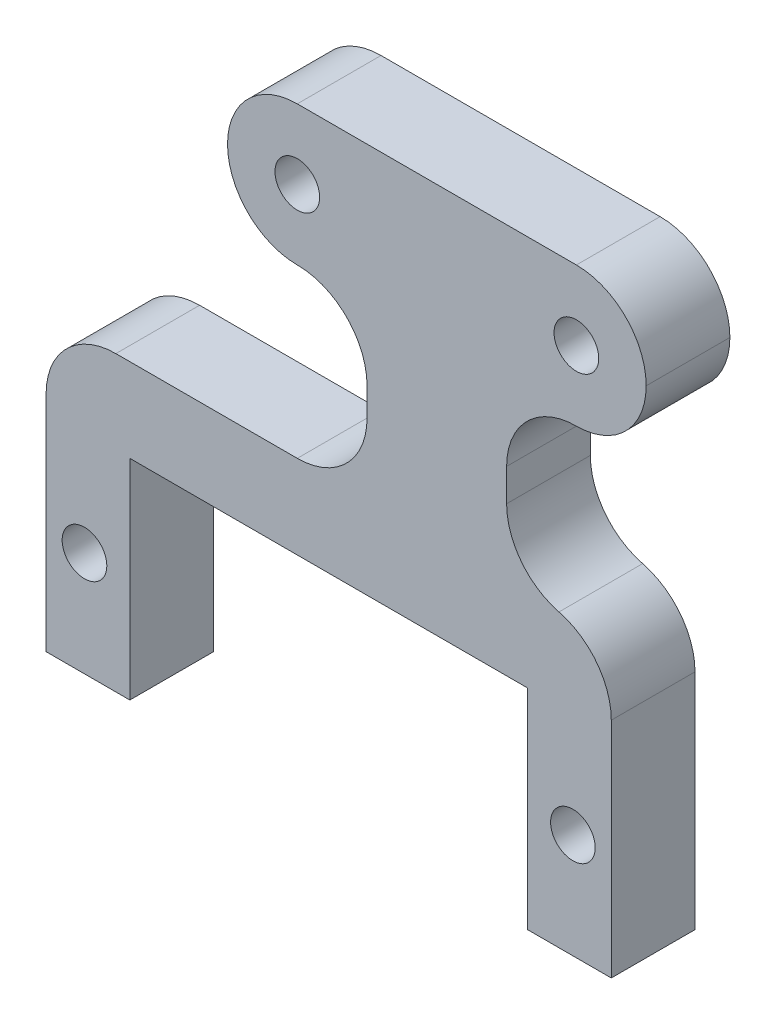
ISO-10303-21;
HEADER;
FILE_DESCRIPTION(('STEP AP214'),'2;1');
FILE_NAME('part.step','',(''),(''),'','','');
FILE_SCHEMA(('AUTOMOTIVE_DESIGN { 1 0 10303 214 1 1 1 1 }'));
ENDSEC;
DATA;
#1=APPLICATION_CONTEXT('core data for automotive mechanical design processes');
#2=APPLICATION_PROTOCOL_DEFINITION('international standard','automotive_design',2000,#1);
#3=PRODUCT_CONTEXT('',#1,'mechanical');
#4=PRODUCT('Part','Part','',(#3));
#5=PRODUCT_RELATED_PRODUCT_CATEGORY('part','',(#4));
#6=PRODUCT_DEFINITION_FORMATION('','',#4);
#7=PRODUCT_DEFINITION_CONTEXT('part definition',#1,'design');
#8=PRODUCT_DEFINITION('design','',#6,#7);
#9=PRODUCT_DEFINITION_SHAPE('','',#8);
#10=(LENGTH_UNIT() NAMED_UNIT(*) SI_UNIT(.MILLI.,.METRE.));
#11=(NAMED_UNIT(*) PLANE_ANGLE_UNIT() SI_UNIT($,.RADIAN.));
#12=(NAMED_UNIT(*) SI_UNIT($,.STERADIAN.) SOLID_ANGLE_UNIT());
#13=UNCERTAINTY_MEASURE_WITH_UNIT(LENGTH_MEASURE(1.E-05),#10,'distance_accuracy_value','');
#14=(GEOMETRIC_REPRESENTATION_CONTEXT(3) GLOBAL_UNCERTAINTY_ASSIGNED_CONTEXT((#13)) GLOBAL_UNIT_ASSIGNED_CONTEXT((#10,
#11,#12)) REPRESENTATION_CONTEXT('',''));
#15=CARTESIAN_POINT('',(0.,0.,0.));
#16=DIRECTION('',(0.,0.,1.));
#17=DIRECTION('',(1.,0.,0.));
#18=AXIS2_PLACEMENT_3D('',#15,#16,#17);
#19=CARTESIAN_POINT('',(-20.25,-15.,6.));
#20=DIRECTION('',(0.,1.,0.));
#21=DIRECTION('',(0.,0.,1.));
#22=AXIS2_PLACEMENT_3D('',#19,#20,#21);
#23=PLANE('',#22);
#24=DIRECTION('',(1.,0.,0.));
#25=VECTOR('',#24,1.);
#26=CARTESIAN_POINT('',(-20.25,-15.,0.));
#27=LINE('',#26,#25);
#28=CARTESIAN_POINT('',(-20.25,-15.,0.));
#29=VERTEX_POINT('',#28);
#30=CARTESIAN_POINT('',(-14.25,-15.,0.));
#31=VERTEX_POINT('',#30);
#32=EDGE_CURVE('E211',#29,#31,#27,.T.);
#33=ORIENTED_EDGE('',*,*,#32,.T.);
#34=DIRECTION('',(0.,0.,-1.));
#35=VECTOR('',#34,1.);
#36=CARTESIAN_POINT('',(-14.25,-15.,6.));
#37=LINE('',#36,#35);
#38=CARTESIAN_POINT('',(-14.25,-15.,6.));
#39=VERTEX_POINT('',#38);
#40=EDGE_CURVE('E192',#39,#31,#37,.T.);
#41=ORIENTED_EDGE('',*,*,#40,.F.);
#42=DIRECTION('',(1.,0.,0.));
#43=VECTOR('',#42,1.);
#44=CARTESIAN_POINT('',(-20.25,-15.,6.));
#45=LINE('',#44,#43);
#46=CARTESIAN_POINT('',(-20.25,-15.,6.));
#47=VERTEX_POINT('',#46);
#48=EDGE_CURVE('E178',#47,#39,#45,.T.);
#49=ORIENTED_EDGE('',*,*,#48,.F.);
#50=DIRECTION('',(0.,0.,-1.));
#51=VECTOR('',#50,1.);
#52=CARTESIAN_POINT('',(-20.25,-15.,6.));
#53=LINE('',#52,#51);
#54=EDGE_CURVE('E190',#47,#29,#53,.T.);
#55=ORIENTED_EDGE('',*,*,#54,.T.);
#56=EDGE_LOOP('',(#33,#41,#49,#55));
#57=FACE_BOUND('',#56,.T.);
#58=ADVANCED_FACE('F33',(#57),#23,.F.);
#59=CARTESIAN_POINT('',(-14.25,0.,6.));
#60=DIRECTION('',(-1.,0.,0.));
#61=DIRECTION('',(0.,-1.,0.));
#62=AXIS2_PLACEMENT_3D('',#59,#60,#61);
#63=PLANE('',#62);
#64=DIRECTION('',(0.,1.,0.));
#65=VECTOR('',#64,1.);
#66=CARTESIAN_POINT('',(-14.25,0.,0.));
#67=LINE('',#66,#65);
#68=CARTESIAN_POINT('',(-14.25,0.,0.));
#69=VERTEX_POINT('',#68);
#70=EDGE_CURVE('E347',#31,#69,#67,.T.);
#71=ORIENTED_EDGE('',*,*,#70,.T.);
#72=DIRECTION('',(0.,0.,-1.));
#73=VECTOR('',#72,1.);
#74=CARTESIAN_POINT('',(-14.25,0.,6.));
#75=LINE('',#74,#73);
#76=CARTESIAN_POINT('',(-14.25,0.,6.));
#77=VERTEX_POINT('',#76);
#78=EDGE_CURVE('E204',#77,#69,#75,.T.);
#79=ORIENTED_EDGE('',*,*,#78,.F.);
#80=DIRECTION('',(0.,1.,0.));
#81=VECTOR('',#80,1.);
#82=CARTESIAN_POINT('',(-14.25,0.,6.));
#83=LINE('',#82,#81);
#84=EDGE_CURVE('E194',#39,#77,#83,.T.);
#85=ORIENTED_EDGE('',*,*,#84,.F.);
#86=ORIENTED_EDGE('',*,*,#40,.T.);
#87=EDGE_LOOP('',(#71,#79,#85,#86));
#88=FACE_BOUND('',#87,.T.);
#89=ADVANCED_FACE('F379',(#88),#63,.F.);
#90=CARTESIAN_POINT('',(-14.25,0.,6.));
#91=DIRECTION('',(0.,1.,0.));
#92=DIRECTION('',(0.,0.,1.));
#93=AXIS2_PLACEMENT_3D('',#90,#91,#92);
#94=PLANE('',#93);
#95=DIRECTION('',(1.,0.,0.));
#96=VECTOR('',#95,1.);
#97=CARTESIAN_POINT('',(-14.25,0.,0.));
#98=LINE('',#97,#96);
#99=CARTESIAN_POINT('',(14.25,0.,0.));
#100=VERTEX_POINT('',#99);
#101=EDGE_CURVE('E342',#69,#100,#98,.T.);
#102=ORIENTED_EDGE('',*,*,#101,.T.);
#103=DIRECTION('',(0.,0.,-1.));
#104=VECTOR('',#103,1.);
#105=CARTESIAN_POINT('',(14.25,0.,6.));
#106=LINE('',#105,#104);
#107=CARTESIAN_POINT('',(14.25,0.,6.));
#108=VERTEX_POINT('',#107);
#109=EDGE_CURVE('E333',#108,#100,#106,.T.);
#110=ORIENTED_EDGE('',*,*,#109,.F.);
#111=DIRECTION('',(1.,0.,0.));
#112=VECTOR('',#111,1.);
#113=CARTESIAN_POINT('',(-14.25,0.,6.));
#114=LINE('',#113,#112);
#115=EDGE_CURVE('E343',#77,#108,#114,.T.);
#116=ORIENTED_EDGE('',*,*,#115,.F.);
#117=ORIENTED_EDGE('',*,*,#78,.T.);
#118=EDGE_LOOP('',(#102,#110,#116,#117));
#119=FACE_BOUND('',#118,.T.);
#120=ADVANCED_FACE('F340',(#119),#94,.F.);
#121=CARTESIAN_POINT('',(14.25,0.,6.));
#122=DIRECTION('',(1.,0.,0.));
#123=DIRECTION('',(0.,1.,0.));
#124=AXIS2_PLACEMENT_3D('',#121,#122,#123);
#125=PLANE('',#124);
#126=DIRECTION('',(0.,-1.,0.));
#127=VECTOR('',#126,1.);
#128=CARTESIAN_POINT('',(14.25,0.,0.));
#129=LINE('',#128,#127);
#130=CARTESIAN_POINT('',(14.25,-15.,0.));
#131=VERTEX_POINT('',#130);
#132=EDGE_CURVE('E349',#100,#131,#129,.T.);
#133=ORIENTED_EDGE('',*,*,#132,.T.);
#134=DIRECTION('',(0.,0.,-1.));
#135=VECTOR('',#134,1.);
#136=CARTESIAN_POINT('',(14.25,-15.,6.));
#137=LINE('',#136,#135);
#138=CARTESIAN_POINT('',(14.25,-15.,6.));
#139=VERTEX_POINT('',#138);
#140=EDGE_CURVE('E329',#139,#131,#137,.T.);
#141=ORIENTED_EDGE('',*,*,#140,.F.);
#142=DIRECTION('',(0.,-1.,0.));
#143=VECTOR('',#142,1.);
#144=CARTESIAN_POINT('',(14.25,0.,6.));
#145=LINE('',#144,#143);
#146=EDGE_CURVE('E370',#108,#139,#145,.T.);
#147=ORIENTED_EDGE('',*,*,#146,.F.);
#148=ORIENTED_EDGE('',*,*,#109,.T.);
#149=EDGE_LOOP('',(#133,#141,#147,#148));
#150=FACE_BOUND('',#149,.T.);
#151=ADVANCED_FACE('F384',(#150),#125,.F.);
#152=CARTESIAN_POINT('',(20.25,-15.,6.));
#153=DIRECTION('',(0.,1.,0.));
#154=DIRECTION('',(0.,0.,1.));
#155=AXIS2_PLACEMENT_3D('',#152,#153,#154);
#156=PLANE('',#155);
#157=DIRECTION('',(1.,0.,0.));
#158=VECTOR('',#157,1.);
#159=CARTESIAN_POINT('',(20.25,-15.,0.));
#160=LINE('',#159,#158);
#161=CARTESIAN_POINT('',(20.25,-15.,0.));
#162=VERTEX_POINT('',#161);
#163=EDGE_CURVE('E316',#131,#162,#160,.T.);
#164=ORIENTED_EDGE('',*,*,#163,.T.);
#165=DIRECTION('',(0.,0.,-1.));
#166=VECTOR('',#165,1.);
#167=CARTESIAN_POINT('',(20.25,-15.,6.));
#168=LINE('',#167,#166);
#169=CARTESIAN_POINT('',(20.25,-15.,6.));
#170=VERTEX_POINT('',#169);
#171=EDGE_CURVE('E326',#170,#162,#168,.T.);
#172=ORIENTED_EDGE('',*,*,#171,.F.);
#173=DIRECTION('',(1.,0.,0.));
#174=VECTOR('',#173,1.);
#175=CARTESIAN_POINT('',(20.25,-15.,6.));
#176=LINE('',#175,#174);
#177=EDGE_CURVE('E366',#139,#170,#176,.T.);
#178=ORIENTED_EDGE('',*,*,#177,.F.);
#179=ORIENTED_EDGE('',*,*,#140,.T.);
#180=EDGE_LOOP('',(#164,#172,#178,#179));
#181=FACE_BOUND('',#180,.T.);
#182=ADVANCED_FACE('F357',(#181),#156,.F.);
#183=CARTESIAN_POINT('',(20.25,-0.694767441860498,6.));
#184=DIRECTION('',(-1.,0.,0.));
#185=DIRECTION('',(0.,0.,1.));
#186=AXIS2_PLACEMENT_3D('',#183,#184,#185);
#187=PLANE('',#186);
#188=DIRECTION('',(0.,1.,0.));
#189=VECTOR('',#188,1.);
#190=CARTESIAN_POINT('',(20.25,-0.694767441860498,0.));
#191=LINE('',#190,#189);
#192=CARTESIAN_POINT('',(20.25,0.999999999999992,0.));
#193=VERTEX_POINT('',#192);
#194=EDGE_CURVE('E310',#162,#193,#191,.T.);
#195=ORIENTED_EDGE('',*,*,#194,.T.);
#196=DIRECTION('',(0.,0.,-1.));
#197=VECTOR('',#196,1.);
#198=CARTESIAN_POINT('',(20.25,0.999999999999992,6.));
#199=LINE('',#198,#197);
#200=CARTESIAN_POINT('',(20.25,0.999999999999992,6.));
#201=VERTEX_POINT('',#200);
#202=EDGE_CURVE('E259',#193,#201,#199,.F.);
#203=ORIENTED_EDGE('',*,*,#202,.T.);
#204=DIRECTION('',(0.,1.,0.));
#205=VECTOR('',#204,1.);
#206=CARTESIAN_POINT('',(20.25,-0.694767441860498,6.));
#207=LINE('',#206,#205);
#208=EDGE_CURVE('E365',#170,#201,#207,.T.);
#209=ORIENTED_EDGE('',*,*,#208,.F.);
#210=ORIENTED_EDGE('',*,*,#171,.T.);
#211=EDGE_LOOP('',(#195,#203,#209,#210));
#212=FACE_BOUND('',#211,.T.);
#213=ADVANCED_FACE('F362',(#212),#187,.F.);
#214=CARTESIAN_POINT('',(12.75,5.99999999999999,6.));
#215=DIRECTION('',(-1.,0.,0.));
#216=DIRECTION('',(0.,0.,1.));
#217=AXIS2_PLACEMENT_3D('',#214,#215,#216);
#218=PLANE('',#217);
#219=DIRECTION('',(0.,1.,0.));
#220=VECTOR('',#219,1.);
#221=CARTESIAN_POINT('',(12.75,5.99999999999999,6.));
#222=LINE('',#221,#220);
#223=CARTESIAN_POINT('',(12.75,10.6824583655185,6.));
#224=VERTEX_POINT('',#223);
#225=CARTESIAN_POINT('',(12.75,13.,6.));
#226=VERTEX_POINT('',#225);
#227=EDGE_CURVE('E303',#224,#226,#222,.T.);
#228=ORIENTED_EDGE('',*,*,#227,.F.);
#229=DIRECTION('',(0.,0.,-1.));
#230=VECTOR('',#229,1.);
#231=CARTESIAN_POINT('',(12.75,10.6824583655185,6.));
#232=LINE('',#231,#230);
#233=CARTESIAN_POINT('',(12.75,10.6824583655185,0.));
#234=VERTEX_POINT('',#233);
#235=EDGE_CURVE('E282',#224,#234,#232,.T.);
#236=ORIENTED_EDGE('',*,*,#235,.T.);
#237=DIRECTION('',(0.,1.,0.));
#238=VECTOR('',#237,1.);
#239=CARTESIAN_POINT('',(12.75,5.99999999999999,0.));
#240=LINE('',#239,#238);
#241=CARTESIAN_POINT('',(12.75,13.,0.));
#242=VERTEX_POINT('',#241);
#243=EDGE_CURVE('E302',#234,#242,#240,.T.);
#244=ORIENTED_EDGE('',*,*,#243,.T.);
#245=DIRECTION('',(0.,0.,-1.));
#246=VECTOR('',#245,1.);
#247=CARTESIAN_POINT('',(12.75,13.,6.));
#248=LINE('',#247,#246);
#249=EDGE_CURVE('E266',#242,#226,#248,.F.);
#250=ORIENTED_EDGE('',*,*,#249,.T.);
#251=EDGE_LOOP('',(#228,#236,#244,#250));
#252=FACE_BOUND('',#251,.T.);
#253=ADVANCED_FACE('F301',(#252),#218,.F.);
#254=CARTESIAN_POINT('',(-7.25,28.,6.));
#255=DIRECTION('',(0.,-1.,0.));
#256=DIRECTION('',(0.,0.,-1.));
#257=AXIS2_PLACEMENT_3D('',#254,#255,#256);
#258=PLANE('',#257);
#259=DIRECTION('',(-1.,0.,0.));
#260=VECTOR('',#259,1.);
#261=CARTESIAN_POINT('',(-7.25,28.,0.));
#262=LINE('',#261,#260);
#263=CARTESIAN_POINT('',(17.75,28.,0.));
#264=VERTEX_POINT('',#263);
#265=CARTESIAN_POINT('',(-2.25,28.,0.));
#266=VERTEX_POINT('',#265);
#267=EDGE_CURVE('E309',#264,#266,#262,.T.);
#268=ORIENTED_EDGE('',*,*,#267,.T.);
#269=DIRECTION('',(0.,0.,-1.));
#270=VECTOR('',#269,1.);
#271=CARTESIAN_POINT('',(-2.25,28.,6.));
#272=LINE('',#271,#270);
#273=CARTESIAN_POINT('',(-2.25,28.,6.));
#274=VERTEX_POINT('',#273);
#275=EDGE_CURVE('E263',#266,#274,#272,.F.);
#276=ORIENTED_EDGE('',*,*,#275,.T.);
#277=DIRECTION('',(-1.,0.,0.));
#278=VECTOR('',#277,1.);
#279=CARTESIAN_POINT('',(-7.25,28.,6.));
#280=LINE('',#279,#278);
#281=CARTESIAN_POINT('',(17.75,28.,6.));
#282=VERTEX_POINT('',#281);
#283=EDGE_CURVE('E368',#282,#274,#280,.T.);
#284=ORIENTED_EDGE('',*,*,#283,.F.);
#285=DIRECTION('',(0.,0.,-1.));
#286=VECTOR('',#285,1.);
#287=CARTESIAN_POINT('',(17.75,28.,6.));
#288=LINE('',#287,#286);
#289=EDGE_CURVE('E261',#282,#264,#288,.T.);
#290=ORIENTED_EDGE('',*,*,#289,.T.);
#291=EDGE_LOOP('',(#268,#276,#284,#290));
#292=FACE_BOUND('',#291,.T.);
#293=ADVANCED_FACE('F451',(#292),#258,.F.);
#294=CARTESIAN_POINT('',(2.75,5.99999999999999,6.));
#295=DIRECTION('',(1.,0.,0.));
#296=DIRECTION('',(0.,1.,0.));
#297=AXIS2_PLACEMENT_3D('',#294,#295,#296);
#298=PLANE('',#297);
#299=DIRECTION('',(0.,-1.,0.));
#300=VECTOR('',#299,1.);
#301=CARTESIAN_POINT('',(2.75,5.99999999999999,0.));
#302=LINE('',#301,#300);
#303=CARTESIAN_POINT('',(2.75,13.,0.));
#304=VERTEX_POINT('',#303);
#305=CARTESIAN_POINT('',(2.75,11.,0.));
#306=VERTEX_POINT('',#305);
#307=EDGE_CURVE('E313',#304,#306,#302,.T.);
#308=ORIENTED_EDGE('',*,*,#307,.T.);
#309=DIRECTION('',(0.,0.,-1.));
#310=VECTOR('',#309,1.);
#311=CARTESIAN_POINT('',(2.75,11.,6.));
#312=LINE('',#311,#310);
#313=CARTESIAN_POINT('',(2.75,11.,6.));
#314=VERTEX_POINT('',#313);
#315=EDGE_CURVE('E232',#306,#314,#312,.F.);
#316=ORIENTED_EDGE('',*,*,#315,.T.);
#317=DIRECTION('',(0.,-1.,0.));
#318=VECTOR('',#317,1.);
#319=CARTESIAN_POINT('',(2.75,5.99999999999999,6.));
#320=LINE('',#319,#318);
#321=CARTESIAN_POINT('',(2.75,13.,6.));
#322=VERTEX_POINT('',#321);
#323=EDGE_CURVE('E376',#322,#314,#320,.T.);
#324=ORIENTED_EDGE('',*,*,#323,.F.);
#325=DIRECTION('',(0.,0.,-1.));
#326=VECTOR('',#325,1.);
#327=CARTESIAN_POINT('',(2.75,13.,0.));
#328=LINE('',#327,#326);
#329=EDGE_CURVE('E230',#322,#304,#328,.T.);
#330=ORIENTED_EDGE('',*,*,#329,.T.);
#331=EDGE_LOOP('',(#308,#316,#324,#330));
#332=FACE_BOUND('',#331,.T.);
#333=ADVANCED_FACE('F531',(#332),#298,.F.);
#334=CARTESIAN_POINT('',(-20.25,5.99999999999999,6.));
#335=DIRECTION('',(0.,-1.,0.));
#336=DIRECTION('',(1.,0.,0.));
#337=AXIS2_PLACEMENT_3D('',#334,#335,#336);
#338=PLANE('',#337);
#339=DIRECTION('',(-1.,0.,0.));
#340=VECTOR('',#339,1.);
#341=CARTESIAN_POINT('',(-20.25,5.99999999999999,6.));
#342=LINE('',#341,#340);
#343=CARTESIAN_POINT('',(-2.25,5.99999999999999,6.));
#344=VERTEX_POINT('',#343);
#345=CARTESIAN_POINT('',(-15.25,5.99999999999999,6.));
#346=VERTEX_POINT('',#345);
#347=EDGE_CURVE('E330',#344,#346,#342,.T.);
#348=ORIENTED_EDGE('',*,*,#347,.F.);
#349=DIRECTION('',(0.,0.,-1.));
#350=VECTOR('',#349,1.);
#351=CARTESIAN_POINT('',(-2.25,5.99999999999999,0.));
#352=LINE('',#351,#350);
#353=CARTESIAN_POINT('',(-2.25,5.99999999999999,0.));
#354=VERTEX_POINT('',#353);
#355=EDGE_CURVE('E227',#344,#354,#352,.T.);
#356=ORIENTED_EDGE('',*,*,#355,.T.);
#357=DIRECTION('',(-1.,0.,0.));
#358=VECTOR('',#357,1.);
#359=CARTESIAN_POINT('',(-20.25,5.99999999999999,0.));
#360=LINE('',#359,#358);
#361=CARTESIAN_POINT('',(-15.25,5.99999999999999,0.));
#362=VERTEX_POINT('',#361);
#363=EDGE_CURVE('E322',#354,#362,#360,.T.);
#364=ORIENTED_EDGE('',*,*,#363,.T.);
#365=DIRECTION('',(0.,0.,-1.));
#366=VECTOR('',#365,1.);
#367=CARTESIAN_POINT('',(-15.25,5.99999999999999,6.));
#368=LINE('',#367,#366);
#369=EDGE_CURVE('E225',#362,#346,#368,.F.);
#370=ORIENTED_EDGE('',*,*,#369,.T.);
#371=EDGE_LOOP('',(#348,#356,#364,#370));
#372=FACE_BOUND('',#371,.T.);
#373=ADVANCED_FACE('F519',(#372),#338,.F.);
#374=CARTESIAN_POINT('',(-20.25,0.,6.));
#375=DIRECTION('',(1.,0.,0.));
#376=DIRECTION('',(0.,0.,-1.));
#377=AXIS2_PLACEMENT_3D('',#374,#375,#376);
#378=PLANE('',#377);
#379=DIRECTION('',(0.,-1.,0.));
#380=VECTOR('',#379,1.);
#381=CARTESIAN_POINT('',(-20.25,0.,6.));
#382=LINE('',#381,#380);
#383=CARTESIAN_POINT('',(-20.25,0.999999999999992,6.));
#384=VERTEX_POINT('',#383);
#385=EDGE_CURVE('E174',#384,#47,#382,.T.);
#386=ORIENTED_EDGE('',*,*,#385,.F.);
#387=DIRECTION('',(0.,0.,-1.));
#388=VECTOR('',#387,1.);
#389=CARTESIAN_POINT('',(-20.25,0.999999999999992,6.));
#390=LINE('',#389,#388);
#391=CARTESIAN_POINT('',(-20.25,0.999999999999992,0.));
#392=VERTEX_POINT('',#391);
#393=EDGE_CURVE('E234',#384,#392,#390,.T.);
#394=ORIENTED_EDGE('',*,*,#393,.T.);
#395=DIRECTION('',(0.,-1.,0.));
#396=VECTOR('',#395,1.);
#397=CARTESIAN_POINT('',(-20.25,0.,0.));
#398=LINE('',#397,#396);
#399=EDGE_CURVE('E186',#392,#29,#398,.T.);
#400=ORIENTED_EDGE('',*,*,#399,.T.);
#401=ORIENTED_EDGE('',*,*,#54,.F.);
#402=EDGE_LOOP('',(#386,#394,#400,#401));
#403=FACE_BOUND('',#402,.T.);
#404=ADVANCED_FACE('F196',(#403),#378,.F.);
#405=CARTESIAN_POINT('',(0.,0.,6.));
#406=DIRECTION('',(0.,0.,1.));
#407=DIRECTION('',(1.,0.,0.));
#408=AXIS2_PLACEMENT_3D('',#405,#406,#407);
#409=PLANE('',#408);
#410=CARTESIAN_POINT('',(-2.25,23.,6.));
#411=DIRECTION('',(0.,0.,-1.));
#412=DIRECTION('',(-1.,0.,0.));
#413=AXIS2_PLACEMENT_3D('',#410,#411,#412);
#414=CIRCLE('',#413,1.6);
#415=CARTESIAN_POINT('',(-3.85,23.,6.));
#416=VERTEX_POINT('',#415);
#417=EDGE_CURVE('E290',#416,#416,#414,.T.);
#418=ORIENTED_EDGE('',*,*,#417,.T.);
#419=EDGE_LOOP('',(#418));
#420=FACE_BOUND('',#419,.T.);
#421=CARTESIAN_POINT('',(17.75,23.,6.));
#422=DIRECTION('',(0.,0.,-1.));
#423=DIRECTION('',(-1.,0.,0.));
#424=AXIS2_PLACEMENT_3D('',#421,#422,#423);
#425=CIRCLE('',#424,1.6);
#426=CARTESIAN_POINT('',(16.15,23.,6.));
#427=VERTEX_POINT('',#426);
#428=EDGE_CURVE('E669',#427,#427,#425,.T.);
#429=ORIENTED_EDGE('',*,*,#428,.T.);
#430=EDGE_LOOP('',(#429));
#431=FACE_BOUND('',#430,.T.);
#432=CARTESIAN_POINT('',(17.5,-7.5,6.));
#433=DIRECTION('',(0.,0.,1.));
#434=DIRECTION('',(1.,0.,0.));
#435=AXIS2_PLACEMENT_3D('',#432,#433,#434);
#436=CIRCLE('',#435,1.6);
#437=CARTESIAN_POINT('',(19.1,-7.5,6.));
#438=VERTEX_POINT('',#437);
#439=EDGE_CURVE('E215',#438,#438,#436,.T.);
#440=ORIENTED_EDGE('',*,*,#439,.F.);
#441=EDGE_LOOP('',(#440));
#442=FACE_BOUND('',#441,.T.);
#443=CARTESIAN_POINT('',(-17.5,-7.5,6.));
#444=DIRECTION('',(0.,0.,1.));
#445=DIRECTION('',(1.,0.,0.));
#446=AXIS2_PLACEMENT_3D('',#443,#444,#445);
#447=CIRCLE('',#446,1.6);
#448=CARTESIAN_POINT('',(-15.9,-7.5,6.));
#449=VERTEX_POINT('',#448);
#450=EDGE_CURVE('E212',#449,#449,#447,.T.);
#451=ORIENTED_EDGE('',*,*,#450,.F.);
#452=EDGE_LOOP('',(#451));
#453=FACE_BOUND('',#452,.T.);
#454=ORIENTED_EDGE('',*,*,#347,.T.);
#455=CARTESIAN_POINT('',(-15.25,0.999999999999992,6.));
#456=DIRECTION('',(0.,0.,1.));
#457=DIRECTION('',(1.,0.,0.));
#458=AXIS2_PLACEMENT_3D('',#455,#456,#457);
#459=CIRCLE('',#458,5.);
#460=EDGE_CURVE('E181',#346,#384,#459,.T.);
#461=ORIENTED_EDGE('',*,*,#460,.T.);
#462=ORIENTED_EDGE('',*,*,#385,.T.);
#463=ORIENTED_EDGE('',*,*,#48,.T.);
#464=ORIENTED_EDGE('',*,*,#84,.T.);
#465=ORIENTED_EDGE('',*,*,#115,.T.);
#466=ORIENTED_EDGE('',*,*,#146,.T.);
#467=ORIENTED_EDGE('',*,*,#177,.T.);
#468=ORIENTED_EDGE('',*,*,#208,.T.);
#469=CARTESIAN_POINT('',(15.25,0.999999999999992,6.));
#470=DIRECTION('',(0.,0.,1.));
#471=DIRECTION('',(1.,0.,0.));
#472=AXIS2_PLACEMENT_3D('',#469,#470,#471);
#473=CIRCLE('',#472,5.);
#474=CARTESIAN_POINT('',(16.5,5.84122918275926,6.));
#475=VERTEX_POINT('',#474);
#476=EDGE_CURVE('E256',#201,#475,#473,.T.);
#477=ORIENTED_EDGE('',*,*,#476,.T.);
#478=CARTESIAN_POINT('',(17.75,10.6824583655185,6.));
#479=DIRECTION('',(0.,0.,1.));
#480=DIRECTION('',(1.,0.,0.));
#481=AXIS2_PLACEMENT_3D('',#478,#479,#480);
#482=CIRCLE('',#481,5.);
#483=EDGE_CURVE('E11',#475,#224,#482,.F.);
#484=ORIENTED_EDGE('',*,*,#483,.T.);
#485=ORIENTED_EDGE('',*,*,#227,.T.);
#486=CARTESIAN_POINT('',(17.75,13.,6.));
#487=DIRECTION('',(0.,0.,1.));
#488=DIRECTION('',(1.,0.,0.));
#489=AXIS2_PLACEMENT_3D('',#486,#487,#488);
#490=CIRCLE('',#489,5.);
#491=CARTESIAN_POINT('',(17.75,18.,6.));
#492=VERTEX_POINT('',#491);
#493=EDGE_CURVE('E280',#226,#492,#490,.F.);
#494=ORIENTED_EDGE('',*,*,#493,.T.);
#495=CARTESIAN_POINT('',(17.75,23.,6.));
#496=DIRECTION('',(0.,0.,1.));
#497=DIRECTION('',(1.,0.,0.));
#498=AXIS2_PLACEMENT_3D('',#495,#496,#497);
#499=CIRCLE('',#498,5.);
#500=CARTESIAN_POINT('',(22.75,23.,6.));
#501=VERTEX_POINT('',#500);
#502=EDGE_CURVE('E250',#492,#501,#499,.T.);
#503=ORIENTED_EDGE('',*,*,#502,.T.);
#504=CARTESIAN_POINT('',(17.75,23.,6.));
#505=DIRECTION('',(0.,0.,1.));
#506=DIRECTION('',(1.,0.,0.));
#507=AXIS2_PLACEMENT_3D('',#504,#505,#506);
#508=CIRCLE('',#507,5.);
#509=EDGE_CURVE('E248',#501,#282,#508,.T.);
#510=ORIENTED_EDGE('',*,*,#509,.T.);
#511=ORIENTED_EDGE('',*,*,#283,.T.);
#512=CARTESIAN_POINT('',(-2.25,23.,6.));
#513=DIRECTION('',(0.,0.,1.));
#514=DIRECTION('',(1.,0.,0.));
#515=AXIS2_PLACEMENT_3D('',#512,#513,#514);
#516=CIRCLE('',#515,5.);
#517=CARTESIAN_POINT('',(-7.25,23.,6.));
#518=VERTEX_POINT('',#517);
#519=EDGE_CURVE('E254',#274,#518,#516,.T.);
#520=ORIENTED_EDGE('',*,*,#519,.T.);
#521=CARTESIAN_POINT('',(-2.25,23.,6.));
#522=DIRECTION('',(0.,0.,1.));
#523=DIRECTION('',(1.,0.,0.));
#524=AXIS2_PLACEMENT_3D('',#521,#522,#523);
#525=CIRCLE('',#524,5.);
#526=CARTESIAN_POINT('',(-2.25,18.,6.));
#527=VERTEX_POINT('',#526);
#528=EDGE_CURVE('E252',#518,#527,#525,.T.);
#529=ORIENTED_EDGE('',*,*,#528,.T.);
#530=CARTESIAN_POINT('',(-2.25,13.,6.));
#531=DIRECTION('',(0.,0.,1.));
#532=DIRECTION('',(1.,0.,0.));
#533=AXIS2_PLACEMENT_3D('',#530,#531,#532);
#534=CIRCLE('',#533,5.);
#535=EDGE_CURVE('E275',#527,#322,#534,.F.);
#536=ORIENTED_EDGE('',*,*,#535,.T.);
#537=ORIENTED_EDGE('',*,*,#323,.T.);
#538=CARTESIAN_POINT('',(-2.25,11.,6.));
#539=DIRECTION('',(0.,0.,1.));
#540=DIRECTION('',(1.,0.,0.));
#541=AXIS2_PLACEMENT_3D('',#538,#539,#540);
#542=CIRCLE('',#541,5.);
#543=EDGE_CURVE('E271',#314,#344,#542,.F.);
#544=ORIENTED_EDGE('',*,*,#543,.T.);
#545=EDGE_LOOP('',(#454,#461,#462,#463,#464,#465,#466,#467,#468,#477,#484,#485,#494,#503,#510,
#511,#520,#529,#536,#537,#544));
#546=FACE_BOUND('',#545,.T.);
#547=ADVANCED_FACE('F177',(#420,#431,#442,#453,#546),#409,.T.);
#548=CARTESIAN_POINT('',(0.,0.,0.));
#549=DIRECTION('',(0.,0.,1.));
#550=DIRECTION('',(1.,0.,0.));
#551=AXIS2_PLACEMENT_3D('',#548,#549,#550);
#552=PLANE('',#551);
#553=CARTESIAN_POINT('',(-2.25,23.,0.));
#554=DIRECTION('',(0.,0.,1.));
#555=DIRECTION('',(1.,0.,0.));
#556=AXIS2_PLACEMENT_3D('',#553,#554,#555);
#557=CIRCLE('',#556,3.69999999999999);
#558=CARTESIAN_POINT('',(1.45,23.,0.));
#559=VERTEX_POINT('',#558);
#560=EDGE_CURVE('E219',#559,#559,#557,.T.);
#561=ORIENTED_EDGE('',*,*,#560,.T.);
#562=EDGE_LOOP('',(#561));
#563=FACE_BOUND('',#562,.T.);
#564=CARTESIAN_POINT('',(17.75,23.,0.));
#565=DIRECTION('',(0.,0.,1.));
#566=DIRECTION('',(1.,0.,0.));
#567=AXIS2_PLACEMENT_3D('',#564,#565,#566);
#568=CIRCLE('',#567,3.69999999999999);
#569=CARTESIAN_POINT('',(21.45,23.,0.));
#570=VERTEX_POINT('',#569);
#571=EDGE_CURVE('E202',#570,#570,#568,.T.);
#572=ORIENTED_EDGE('',*,*,#571,.T.);
#573=EDGE_LOOP('',(#572));
#574=FACE_BOUND('',#573,.T.);
#575=CARTESIAN_POINT('',(17.5,-7.5,0.));
#576=DIRECTION('',(0.,0.,1.));
#577=DIRECTION('',(1.,0.,0.));
#578=AXIS2_PLACEMENT_3D('',#575,#576,#577);
#579=CIRCLE('',#578,1.6);
#580=CARTESIAN_POINT('',(19.1,-7.5,0.));
#581=VERTEX_POINT('',#580);
#582=EDGE_CURVE('E213',#581,#581,#579,.T.);
#583=ORIENTED_EDGE('',*,*,#582,.T.);
#584=EDGE_LOOP('',(#583));
#585=FACE_BOUND('',#584,.T.);
#586=CARTESIAN_POINT('',(-17.5,-7.5,0.));
#587=DIRECTION('',(0.,0.,1.));
#588=DIRECTION('',(1.,0.,0.));
#589=AXIS2_PLACEMENT_3D('',#586,#587,#588);
#590=CIRCLE('',#589,1.6);
#591=CARTESIAN_POINT('',(-15.9,-7.5,0.));
#592=VERTEX_POINT('',#591);
#593=EDGE_CURVE('E208',#592,#592,#590,.T.);
#594=ORIENTED_EDGE('',*,*,#593,.T.);
#595=EDGE_LOOP('',(#594));
#596=FACE_BOUND('',#595,.T.);
#597=ORIENTED_EDGE('',*,*,#399,.F.);
#598=CARTESIAN_POINT('',(-15.25,0.999999999999992,0.));
#599=DIRECTION('',(0.,0.,1.));
#600=DIRECTION('',(1.,0.,0.));
#601=AXIS2_PLACEMENT_3D('',#598,#599,#600);
#602=CIRCLE('',#601,5.);
#603=EDGE_CURVE('E246',#392,#362,#602,.F.);
#604=ORIENTED_EDGE('',*,*,#603,.T.);
#605=ORIENTED_EDGE('',*,*,#363,.F.);
#606=CARTESIAN_POINT('',(-2.25,11.,0.));
#607=DIRECTION('',(0.,0.,1.));
#608=DIRECTION('',(1.,0.,0.));
#609=AXIS2_PLACEMENT_3D('',#606,#607,#608);
#610=CIRCLE('',#609,5.);
#611=EDGE_CURVE('E269',#354,#306,#610,.T.);
#612=ORIENTED_EDGE('',*,*,#611,.T.);
#613=ORIENTED_EDGE('',*,*,#307,.F.);
#614=CARTESIAN_POINT('',(-2.25,13.,0.));
#615=DIRECTION('',(0.,0.,1.));
#616=DIRECTION('',(1.,0.,0.));
#617=AXIS2_PLACEMENT_3D('',#614,#615,#616);
#618=CIRCLE('',#617,5.);
#619=CARTESIAN_POINT('',(-2.25,18.,0.));
#620=VERTEX_POINT('',#619);
#621=EDGE_CURVE('E273',#304,#620,#618,.T.);
#622=ORIENTED_EDGE('',*,*,#621,.T.);
#623=CARTESIAN_POINT('',(-2.25,23.,0.));
#624=DIRECTION('',(0.,0.,1.));
#625=DIRECTION('',(1.,0.,0.));
#626=AXIS2_PLACEMENT_3D('',#623,#624,#625);
#627=CIRCLE('',#626,5.);
#628=CARTESIAN_POINT('',(-7.25,23.,0.));
#629=VERTEX_POINT('',#628);
#630=EDGE_CURVE('E240',#620,#629,#627,.F.);
#631=ORIENTED_EDGE('',*,*,#630,.T.);
#632=CARTESIAN_POINT('',(-2.25,23.,0.));
#633=DIRECTION('',(0.,0.,1.));
#634=DIRECTION('',(1.,0.,0.));
#635=AXIS2_PLACEMENT_3D('',#632,#633,#634);
#636=CIRCLE('',#635,5.);
#637=EDGE_CURVE('E242',#629,#266,#636,.F.);
#638=ORIENTED_EDGE('',*,*,#637,.T.);
#639=ORIENTED_EDGE('',*,*,#267,.F.);
#640=CARTESIAN_POINT('',(17.75,23.,0.));
#641=DIRECTION('',(0.,0.,1.));
#642=DIRECTION('',(1.,0.,0.));
#643=AXIS2_PLACEMENT_3D('',#640,#641,#642);
#644=CIRCLE('',#643,5.);
#645=CARTESIAN_POINT('',(22.75,23.,0.));
#646=VERTEX_POINT('',#645);
#647=EDGE_CURVE('E236',#264,#646,#644,.F.);
#648=ORIENTED_EDGE('',*,*,#647,.T.);
#649=CARTESIAN_POINT('',(17.75,23.,0.));
#650=DIRECTION('',(0.,0.,1.));
#651=DIRECTION('',(1.,0.,0.));
#652=AXIS2_PLACEMENT_3D('',#649,#650,#651);
#653=CIRCLE('',#652,5.);
#654=CARTESIAN_POINT('',(17.75,18.,0.));
#655=VERTEX_POINT('',#654);
#656=EDGE_CURVE('E238',#646,#655,#653,.F.);
#657=ORIENTED_EDGE('',*,*,#656,.T.);
#658=CARTESIAN_POINT('',(17.75,13.,0.));
#659=DIRECTION('',(0.,0.,1.));
#660=DIRECTION('',(1.,0.,0.));
#661=AXIS2_PLACEMENT_3D('',#658,#659,#660);
#662=CIRCLE('',#661,5.);
#663=EDGE_CURVE('E277',#655,#242,#662,.T.);
#664=ORIENTED_EDGE('',*,*,#663,.T.);
#665=ORIENTED_EDGE('',*,*,#243,.F.);
#666=CARTESIAN_POINT('',(17.75,10.6824583655185,0.));
#667=DIRECTION('',(0.,0.,1.));
#668=DIRECTION('',(1.,0.,0.));
#669=AXIS2_PLACEMENT_3D('',#666,#667,#668);
#670=CIRCLE('',#669,5.);
#671=CARTESIAN_POINT('',(16.5,5.84122918275926,0.));
#672=VERTEX_POINT('',#671);
#673=EDGE_CURVE('E41',#234,#672,#670,.T.);
#674=ORIENTED_EDGE('',*,*,#673,.T.);
#675=CARTESIAN_POINT('',(15.25,0.999999999999992,0.));
#676=DIRECTION('',(0.,0.,1.));
#677=DIRECTION('',(1.,0.,0.));
#678=AXIS2_PLACEMENT_3D('',#675,#676,#677);
#679=CIRCLE('',#678,5.);
#680=EDGE_CURVE('E244',#672,#193,#679,.F.);
#681=ORIENTED_EDGE('',*,*,#680,.T.);
#682=ORIENTED_EDGE('',*,*,#194,.F.);
#683=ORIENTED_EDGE('',*,*,#163,.F.);
#684=ORIENTED_EDGE('',*,*,#132,.F.);
#685=ORIENTED_EDGE('',*,*,#101,.F.);
#686=ORIENTED_EDGE('',*,*,#70,.F.);
#687=ORIENTED_EDGE('',*,*,#32,.F.);
#688=EDGE_LOOP('',(#597,#604,#605,#612,#613,#622,#631,#638,#639,#648,#657,#664,#665,#674,#681,
#682,#683,#684,#685,#686,#687));
#689=FACE_BOUND('',#688,.T.);
#690=ADVANCED_FACE('F306',(#563,#574,#585,#596,#689),#552,.F.);
#691=CARTESIAN_POINT('',(-17.5,-7.5,-4.));
#692=DIRECTION('',(0.,0.,1.));
#693=DIRECTION('',(1.,0.,0.));
#694=AXIS2_PLACEMENT_3D('',#691,#692,#693);
#695=CYLINDRICAL_SURFACE('',#694,1.6);
#696=ORIENTED_EDGE('',*,*,#450,.T.);
#697=EDGE_LOOP('',(#696));
#698=FACE_BOUND('',#697,.T.);
#699=ORIENTED_EDGE('',*,*,#593,.F.);
#700=EDGE_LOOP('',(#699));
#701=FACE_BOUND('',#700,.T.);
#702=ADVANCED_FACE('F600',(#698,#701),#695,.F.);
#703=CARTESIAN_POINT('',(17.5,-7.5,-4.));
#704=DIRECTION('',(0.,0.,1.));
#705=DIRECTION('',(1.,0.,0.));
#706=AXIS2_PLACEMENT_3D('',#703,#704,#705);
#707=CYLINDRICAL_SURFACE('',#706,1.6);
#708=ORIENTED_EDGE('',*,*,#439,.T.);
#709=EDGE_LOOP('',(#708));
#710=FACE_BOUND('',#709,.T.);
#711=ORIENTED_EDGE('',*,*,#582,.F.);
#712=EDGE_LOOP('',(#711));
#713=FACE_BOUND('',#712,.T.);
#714=ADVANCED_FACE('F590',(#710,#713),#707,.F.);
#715=CARTESIAN_POINT('',(17.75,23.,6.));
#716=DIRECTION('',(0.,0.,-1.));
#717=DIRECTION('',(-1.,0.,0.));
#718=AXIS2_PLACEMENT_3D('',#715,#716,#717);
#719=CYLINDRICAL_SURFACE('',#718,1.6);
#720=CARTESIAN_POINT('',(17.75,23.,2.09999999999999));
#721=DIRECTION('',(0.,0.,1.));
#722=DIRECTION('',(1.,0.,0.));
#723=AXIS2_PLACEMENT_3D('',#720,#721,#722);
#724=CIRCLE('',#723,1.6);
#725=CARTESIAN_POINT('',(19.35,23.,2.09999999999999));
#726=VERTEX_POINT('',#725);
#727=EDGE_CURVE('E222',#726,#726,#724,.F.);
#728=ORIENTED_EDGE('',*,*,#727,.T.);
#729=EDGE_LOOP('',(#728));
#730=FACE_BOUND('',#729,.T.);
#731=ORIENTED_EDGE('',*,*,#428,.F.);
#732=EDGE_LOOP('',(#731));
#733=FACE_BOUND('',#732,.T.);
#734=ADVANCED_FACE('F580',(#730,#733),#719,.F.);
#735=CARTESIAN_POINT('',(-2.25,23.,6.));
#736=DIRECTION('',(0.,0.,-1.));
#737=DIRECTION('',(-1.,0.,0.));
#738=AXIS2_PLACEMENT_3D('',#735,#736,#737);
#739=CYLINDRICAL_SURFACE('',#738,1.6);
#740=CARTESIAN_POINT('',(-2.25,23.,2.09999999999999));
#741=DIRECTION('',(0.,0.,1.));
#742=DIRECTION('',(1.,0.,0.));
#743=AXIS2_PLACEMENT_3D('',#740,#741,#742);
#744=CIRCLE('',#743,1.6);
#745=CARTESIAN_POINT('',(-0.649999999999999,23.,2.09999999999999));
#746=VERTEX_POINT('',#745);
#747=EDGE_CURVE('E199',#746,#746,#744,.F.);
#748=ORIENTED_EDGE('',*,*,#747,.T.);
#749=EDGE_LOOP('',(#748));
#750=FACE_BOUND('',#749,.T.);
#751=ORIENTED_EDGE('',*,*,#417,.F.);
#752=EDGE_LOOP('',(#751));
#753=FACE_BOUND('',#752,.T.);
#754=ADVANCED_FACE('F404',(#750,#753),#739,.F.);
#755=CARTESIAN_POINT('',(-2.25,23.,2.09999999999999));
#756=DIRECTION('',(0.,0.,-1.));
#757=DIRECTION('',(-1.,0.,0.));
#758=AXIS2_PLACEMENT_3D('',#755,#756,#757);
#759=CONICAL_SURFACE('',#758,1.6,0.785398163397449);
#760=ORIENTED_EDGE('',*,*,#560,.F.);
#761=EDGE_LOOP('',(#760));
#762=FACE_BOUND('',#761,.T.);
#763=ORIENTED_EDGE('',*,*,#747,.F.);
#764=EDGE_LOOP('',(#763));
#765=FACE_BOUND('',#764,.T.);
#766=ADVANCED_FACE('F400',(#762,#765),#759,.F.);
#767=CARTESIAN_POINT('',(17.75,23.,2.09999999999999));
#768=DIRECTION('',(0.,0.,-1.));
#769=DIRECTION('',(-1.,0.,0.));
#770=AXIS2_PLACEMENT_3D('',#767,#768,#769);
#771=CONICAL_SURFACE('',#770,1.6,0.785398163397449);
#772=ORIENTED_EDGE('',*,*,#571,.F.);
#773=EDGE_LOOP('',(#772));
#774=FACE_BOUND('',#773,.T.);
#775=ORIENTED_EDGE('',*,*,#727,.F.);
#776=EDGE_LOOP('',(#775));
#777=FACE_BOUND('',#776,.T.);
#778=ADVANCED_FACE('F403',(#774,#777),#771,.F.);
#779=CARTESIAN_POINT('',(-2.25,11.,6.));
#780=DIRECTION('',(0.,0.,1.));
#781=DIRECTION('',(1.,0.,0.));
#782=AXIS2_PLACEMENT_3D('',#779,#780,#781);
#783=CYLINDRICAL_SURFACE('',#782,5.);
#784=ORIENTED_EDGE('',*,*,#543,.F.);
#785=ORIENTED_EDGE('',*,*,#315,.F.);
#786=ORIENTED_EDGE('',*,*,#611,.F.);
#787=ORIENTED_EDGE('',*,*,#355,.F.);
#788=EDGE_LOOP('',(#784,#785,#786,#787));
#789=FACE_BOUND('',#788,.T.);
#790=ADVANCED_FACE('F408',(#789),#783,.F.);
#791=CARTESIAN_POINT('',(-15.25,0.999999999999992,6.));
#792=DIRECTION('',(0.,0.,-1.));
#793=DIRECTION('',(-1.,0.,0.));
#794=AXIS2_PLACEMENT_3D('',#791,#792,#793);
#795=CYLINDRICAL_SURFACE('',#794,5.);
#796=ORIENTED_EDGE('',*,*,#460,.F.);
#797=ORIENTED_EDGE('',*,*,#369,.F.);
#798=ORIENTED_EDGE('',*,*,#603,.F.);
#799=ORIENTED_EDGE('',*,*,#393,.F.);
#800=EDGE_LOOP('',(#796,#797,#798,#799));
#801=FACE_BOUND('',#800,.T.);
#802=ADVANCED_FACE('F412',(#801),#795,.T.);
#803=CARTESIAN_POINT('',(15.25,0.999999999999992,6.));
#804=DIRECTION('',(0.,0.,-1.));
#805=DIRECTION('',(-1.,0.,0.));
#806=AXIS2_PLACEMENT_3D('',#803,#804,#805);
#807=CYLINDRICAL_SURFACE('',#806,5.);
#808=ORIENTED_EDGE('',*,*,#680,.F.);
#809=DIRECTION('',(0.,0.,-1.));
#810=VECTOR('',#809,1.);
#811=CARTESIAN_POINT('',(16.5,5.84122918275926,6.));
#812=LINE('',#811,#810);
#813=EDGE_CURVE('E54',#672,#475,#812,.F.);
#814=ORIENTED_EDGE('',*,*,#813,.T.);
#815=ORIENTED_EDGE('',*,*,#476,.F.);
#816=ORIENTED_EDGE('',*,*,#202,.F.);
#817=EDGE_LOOP('',(#808,#814,#815,#816));
#818=FACE_BOUND('',#817,.T.);
#819=ADVANCED_FACE('F416',(#818),#807,.T.);
#820=CARTESIAN_POINT('',(-2.25,13.,6.));
#821=DIRECTION('',(0.,0.,1.));
#822=DIRECTION('',(1.,0.,0.));
#823=AXIS2_PLACEMENT_3D('',#820,#821,#822);
#824=CYLINDRICAL_SURFACE('',#823,5.);
#825=ORIENTED_EDGE('',*,*,#329,.F.);
#826=ORIENTED_EDGE('',*,*,#535,.F.);
#827=DIRECTION('',(0.,0.,-1.));
#828=VECTOR('',#827,1.);
#829=CARTESIAN_POINT('',(-2.25,18.,6.));
#830=LINE('',#829,#828);
#831=EDGE_CURVE('E286',#620,#527,#830,.F.);
#832=ORIENTED_EDGE('',*,*,#831,.F.);
#833=ORIENTED_EDGE('',*,*,#621,.F.);
#834=EDGE_LOOP('',(#825,#826,#832,#833));
#835=FACE_BOUND('',#834,.T.);
#836=ADVANCED_FACE('F420',(#835),#824,.F.);
#837=CARTESIAN_POINT('',(-2.25,23.,6.));
#838=DIRECTION('',(0.,0.,-1.));
#839=DIRECTION('',(-1.,0.,0.));
#840=AXIS2_PLACEMENT_3D('',#837,#838,#839);
#841=CYLINDRICAL_SURFACE('',#840,5.);
#842=ORIENTED_EDGE('',*,*,#831,.T.);
#843=ORIENTED_EDGE('',*,*,#528,.F.);
#844=DIRECTION('',(0.,0.,-1.));
#845=VECTOR('',#844,1.);
#846=CARTESIAN_POINT('',(-7.25,23.,6.));
#847=LINE('',#846,#845);
#848=EDGE_CURVE('E283',#629,#518,#847,.F.);
#849=ORIENTED_EDGE('',*,*,#848,.F.);
#850=ORIENTED_EDGE('',*,*,#630,.F.);
#851=EDGE_LOOP('',(#842,#843,#849,#850));
#852=FACE_BOUND('',#851,.T.);
#853=ADVANCED_FACE('F425',(#852),#841,.T.);
#854=CARTESIAN_POINT('',(-2.25,23.,6.));
#855=DIRECTION('',(0.,0.,-1.));
#856=DIRECTION('',(-1.,0.,0.));
#857=AXIS2_PLACEMENT_3D('',#854,#855,#856);
#858=CYLINDRICAL_SURFACE('',#857,5.);
#859=ORIENTED_EDGE('',*,*,#519,.F.);
#860=ORIENTED_EDGE('',*,*,#275,.F.);
#861=ORIENTED_EDGE('',*,*,#637,.F.);
#862=ORIENTED_EDGE('',*,*,#848,.T.);
#863=EDGE_LOOP('',(#859,#860,#861,#862));
#864=FACE_BOUND('',#863,.T.);
#865=ADVANCED_FACE('F421',(#864),#858,.T.);
#866=CARTESIAN_POINT('',(17.75,23.,6.));
#867=DIRECTION('',(0.,0.,-1.));
#868=DIRECTION('',(-1.,0.,0.));
#869=AXIS2_PLACEMENT_3D('',#866,#867,#868);
#870=CYLINDRICAL_SURFACE('',#869,5.);
#871=ORIENTED_EDGE('',*,*,#289,.F.);
#872=ORIENTED_EDGE('',*,*,#509,.F.);
#873=DIRECTION('',(0.,0.,-1.));
#874=VECTOR('',#873,1.);
#875=CARTESIAN_POINT('',(22.75,23.,6.));
#876=LINE('',#875,#874);
#877=EDGE_CURVE('E287',#646,#501,#876,.F.);
#878=ORIENTED_EDGE('',*,*,#877,.F.);
#879=ORIENTED_EDGE('',*,*,#647,.F.);
#880=EDGE_LOOP('',(#871,#872,#878,#879));
#881=FACE_BOUND('',#880,.T.);
#882=ADVANCED_FACE('F424',(#881),#870,.T.);
#883=CARTESIAN_POINT('',(17.75,23.,6.));
#884=DIRECTION('',(0.,0.,-1.));
#885=DIRECTION('',(-1.,0.,0.));
#886=AXIS2_PLACEMENT_3D('',#883,#884,#885);
#887=CYLINDRICAL_SURFACE('',#886,5.);
#888=ORIENTED_EDGE('',*,*,#877,.T.);
#889=ORIENTED_EDGE('',*,*,#502,.F.);
#890=DIRECTION('',(0.,0.,-1.));
#891=VECTOR('',#890,1.);
#892=CARTESIAN_POINT('',(17.75,18.,6.));
#893=LINE('',#892,#891);
#894=EDGE_CURVE('E291',#655,#492,#893,.F.);
#895=ORIENTED_EDGE('',*,*,#894,.F.);
#896=ORIENTED_EDGE('',*,*,#656,.F.);
#897=EDGE_LOOP('',(#888,#889,#895,#896));
#898=FACE_BOUND('',#897,.T.);
#899=ADVANCED_FACE('F436',(#898),#887,.T.);
#900=CARTESIAN_POINT('',(17.75,13.,6.));
#901=DIRECTION('',(0.,0.,1.));
#902=DIRECTION('',(1.,0.,0.));
#903=AXIS2_PLACEMENT_3D('',#900,#901,#902);
#904=CYLINDRICAL_SURFACE('',#903,5.);
#905=ORIENTED_EDGE('',*,*,#493,.F.);
#906=ORIENTED_EDGE('',*,*,#249,.F.);
#907=ORIENTED_EDGE('',*,*,#663,.F.);
#908=ORIENTED_EDGE('',*,*,#894,.T.);
#909=EDGE_LOOP('',(#905,#906,#907,#908));
#910=FACE_BOUND('',#909,.T.);
#911=ADVANCED_FACE('F433',(#910),#904,.F.);
#912=CARTESIAN_POINT('',(17.75,10.6824583655185,6.));
#913=DIRECTION('',(0.,0.,-1.));
#914=DIRECTION('',(-1.,0.,0.));
#915=AXIS2_PLACEMENT_3D('',#912,#913,#914);
#916=CYLINDRICAL_SURFACE('',#915,5.);
#917=ORIENTED_EDGE('',*,*,#483,.F.);
#918=ORIENTED_EDGE('',*,*,#813,.F.);
#919=ORIENTED_EDGE('',*,*,#673,.F.);
#920=ORIENTED_EDGE('',*,*,#235,.F.);
#921=EDGE_LOOP('',(#917,#918,#919,#920));
#922=FACE_BOUND('',#921,.T.);
#923=ADVANCED_FACE('F35',(#922),#916,.F.);
#924=CLOSED_SHELL('',(#58,#89,#120,#151,#182,#213,#253,#293,#333,#373,#404,#547,#690,#702,#714,
#734,#754,#766,#778,#790,#802,#819,#836,#853,#865,#882,#899,#911,#923));
#925=MANIFOLD_SOLID_BREP('B2',#924);
#926=ADVANCED_BREP_SHAPE_REPRESENTATION('',(#18,#925),#14);
#927=SHAPE_DEFINITION_REPRESENTATION(#9,#926);
ENDSEC;
END-ISO-10303-21;
